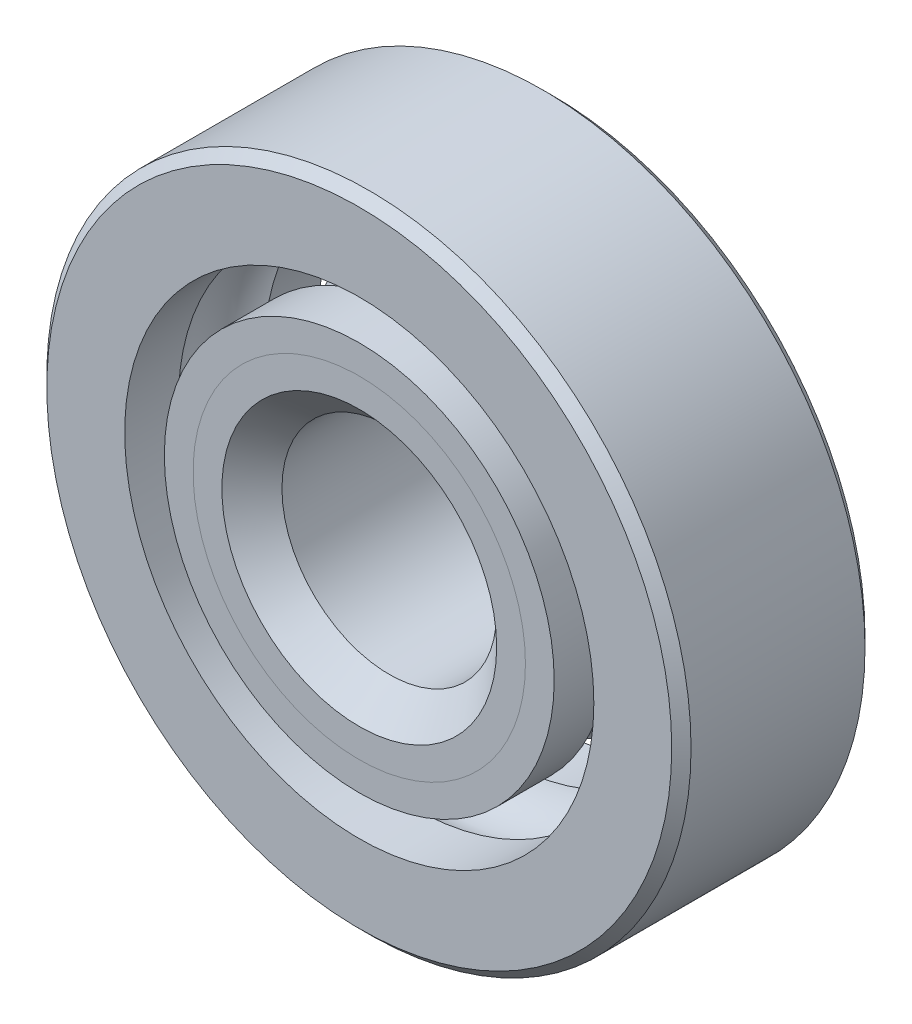
ISO-10303-21;
HEADER;
FILE_DESCRIPTION(('STEP AP214'),'2;1');
FILE_NAME('part.step','',(''),(''),'','','');
FILE_SCHEMA(('AUTOMOTIVE_DESIGN { 1 0 10303 214 1 1 1 1 }'));
ENDSEC;
DATA;
#1=APPLICATION_CONTEXT('core data for automotive mechanical design processes');
#2=APPLICATION_PROTOCOL_DEFINITION('international standard','automotive_design',2000,#1);
#3=PRODUCT_CONTEXT('',#1,'mechanical');
#4=PRODUCT('Part','Part','',(#3));
#5=PRODUCT_RELATED_PRODUCT_CATEGORY('part','',(#4));
#6=PRODUCT_DEFINITION_FORMATION('','',#4);
#7=PRODUCT_DEFINITION_CONTEXT('part definition',#1,'design');
#8=PRODUCT_DEFINITION('design','',#6,#7);
#9=PRODUCT_DEFINITION_SHAPE('','',#8);
#10=(LENGTH_UNIT() NAMED_UNIT(*) SI_UNIT(.MILLI.,.METRE.));
#11=(NAMED_UNIT(*) PLANE_ANGLE_UNIT() SI_UNIT($,.RADIAN.));
#12=(NAMED_UNIT(*) SI_UNIT($,.STERADIAN.) SOLID_ANGLE_UNIT());
#13=UNCERTAINTY_MEASURE_WITH_UNIT(LENGTH_MEASURE(1.E-05),#10,'distance_accuracy_value','');
#14=(GEOMETRIC_REPRESENTATION_CONTEXT(3) GLOBAL_UNCERTAINTY_ASSIGNED_CONTEXT((#13)) GLOBAL_UNIT_ASSIGNED_CONTEXT((#10,
#11,#12)) REPRESENTATION_CONTEXT('',''));
#15=CARTESIAN_POINT('',(0.,0.,0.));
#16=DIRECTION('',(0.,0.,1.));
#17=DIRECTION('',(1.,0.,0.));
#18=AXIS2_PLACEMENT_3D('',#15,#16,#17);
#19=CARTESIAN_POINT('',(0.,10.,0.));
#20=DIRECTION('',(0.,0.,1.));
#21=DIRECTION('',(0.,1.,0.));
#22=AXIS2_PLACEMENT_3D('',#19,#20,#21);
#23=SPHERICAL_SURFACE('',#22,2.20274170204252);
#24=CARTESIAN_POINT('',(0.,10.,2.20274170204251));
#25=VERTEX_POINT('',#24);
#26=VERTEX_LOOP('',#25);
#27=FACE_BOUND('',#26,.T.);
#28=ADVANCED_FACE('F39',(#27),#23,.T.);
#29=CLOSED_SHELL('',(#28));
#30=MANIFOLD_SOLID_BREP('B2',#29);
#31=CARTESIAN_POINT('',(0.,7.73777611295091,4.5));
#32=DIRECTION('',(0.,0.,-1.));
#33=DIRECTION('',(-1.,0.,0.));
#34=AXIS2_PLACEMENT_3D('',#31,#32,#33);
#35=PLANE('',#34);
#36=CARTESIAN_POINT('',(0.,0.,4.5));
#37=DIRECTION('',(0.,0.,1.));
#38=DIRECTION('',(1.,0.,0.));
#39=AXIS2_PLACEMENT_3D('',#36,#37,#38);
#40=CIRCLE('',#39,6.39862914897875);
#41=CARTESIAN_POINT('',(6.39862914897875,0.,4.5));
#42=VERTEX_POINT('',#41);
#43=EDGE_CURVE('E93',#42,#42,#40,.T.);
#44=ORIENTED_EDGE('',*,*,#43,.F.);
#45=EDGE_LOOP('',(#44));
#46=FACE_BOUND('',#45,.T.);
#47=CARTESIAN_POINT('',(0.,0.,4.5));
#48=DIRECTION('',(0.,0.,1.));
#49=DIRECTION('',(1.,0.,0.));
#50=AXIS2_PLACEMENT_3D('',#47,#48,#49);
#51=CIRCLE('',#50,7.73777611295091);
#52=CARTESIAN_POINT('',(7.73777611295091,0.,4.5));
#53=VERTEX_POINT('',#52);
#54=EDGE_CURVE('E38',#53,#53,#51,.T.);
#55=ORIENTED_EDGE('',*,*,#54,.T.);
#56=EDGE_LOOP('',(#55));
#57=FACE_BOUND('',#56,.T.);
#58=ADVANCED_FACE('F59',(#46,#57),#35,.F.);
#59=CARTESIAN_POINT('',(0.,0.,3.16085303602784));
#60=DIRECTION('',(0.,0.,1.));
#61=DIRECTION('',(1.,0.,0.));
#62=AXIS2_PLACEMENT_3D('',#59,#60,#61);
#63=CONICAL_SURFACE('',#62,6.39862914897875,0.78539816339745);
#64=ORIENTED_EDGE('',*,*,#54,.F.);
#65=EDGE_LOOP('',(#64));
#66=FACE_BOUND('',#65,.T.);
#67=CARTESIAN_POINT('',(0.,0.,3.16085303602784));
#68=DIRECTION('',(0.,0.,1.));
#69=DIRECTION('',(1.,0.,0.));
#70=AXIS2_PLACEMENT_3D('',#67,#68,#69);
#71=CIRCLE('',#70,6.39862914897875);
#72=CARTESIAN_POINT('',(6.39862914897875,0.,3.16085303602784));
#73=VERTEX_POINT('',#72);
#74=EDGE_CURVE('E65',#73,#73,#71,.T.);
#75=ORIENTED_EDGE('',*,*,#74,.T.);
#76=EDGE_LOOP('',(#75));
#77=FACE_BOUND('',#76,.T.);
#78=ADVANCED_FACE('F100',(#66,#77),#63,.T.);
#79=CARTESIAN_POINT('',(0.,0.,4.5));
#80=DIRECTION('',(0.,0.,1.));
#81=DIRECTION('',(1.,0.,0.));
#82=AXIS2_PLACEMENT_3D('',#79,#80,#81);
#83=CYLINDRICAL_SURFACE('',#82,6.39862914897875);
#84=ORIENTED_EDGE('',*,*,#74,.F.);
#85=EDGE_LOOP('',(#84));
#86=FACE_BOUND('',#85,.T.);
#87=CARTESIAN_POINT('',(0.,0.,0.));
#88=DIRECTION('',(0.,0.,1.));
#89=DIRECTION('',(1.,0.,0.));
#90=AXIS2_PLACEMENT_3D('',#87,#88,#89);
#91=CIRCLE('',#90,6.39862914897875);
#92=CARTESIAN_POINT('',(6.39862914897875,0.,0.));
#93=VERTEX_POINT('',#92);
#94=EDGE_CURVE('E69',#93,#93,#91,.T.);
#95=ORIENTED_EDGE('',*,*,#94,.T.);
#96=EDGE_LOOP('',(#95));
#97=FACE_BOUND('',#96,.T.);
#98=ADVANCED_FACE('F104',(#86,#97),#83,.T.);
#99=CARTESIAN_POINT('',(0.,6.39862914897875,0.));
#100=DIRECTION('',(0.,0.,-1.));
#101=DIRECTION('',(-1.,0.,0.));
#102=AXIS2_PLACEMENT_3D('',#99,#100,#101);
#103=PLANE('',#102);
#104=ORIENTED_EDGE('',*,*,#94,.F.);
#105=EDGE_LOOP('',(#104));
#106=FACE_BOUND('',#105,.T.);
#107=CARTESIAN_POINT('',(0.,0.,0.));
#108=DIRECTION('',(0.,0.,1.));
#109=DIRECTION('',(1.,0.,0.));
#110=AXIS2_PLACEMENT_3D('',#107,#108,#109);
#111=CIRCLE('',#110,7.79725829795749);
#112=CARTESIAN_POINT('',(7.79725829795749,0.,0.));
#113=VERTEX_POINT('',#112);
#114=EDGE_CURVE('E73',#113,#113,#111,.T.);
#115=ORIENTED_EDGE('',*,*,#114,.T.);
#116=EDGE_LOOP('',(#115));
#117=FACE_BOUND('',#116,.T.);
#118=ADVANCED_FACE('F109',(#106,#117),#103,.F.);
#119=CARTESIAN_POINT('',(0.,0.,0.));
#120=DIRECTION('',(0.,0.,1.));
#121=DIRECTION('',(1.,0.,0.));
#122=AXIS2_PLACEMENT_3D('',#119,#120,#121);
#123=TOROIDAL_SURFACE('',#122,10.,2.20274170204251);
#124=ORIENTED_EDGE('',*,*,#114,.F.);
#125=EDGE_LOOP('',(#124));
#126=FACE_BOUND('',#125,.T.);
#127=CARTESIAN_POINT('',(0.,0.,-2.));
#128=DIRECTION('',(0.,0.,1.));
#129=DIRECTION('',(1.,0.,0.));
#130=AXIS2_PLACEMENT_3D('',#127,#128,#129);
#131=CIRCLE('',#130,9.07692307692308);
#132=CARTESIAN_POINT('',(9.07692307692308,0.,-2.));
#133=VERTEX_POINT('',#132);
#134=EDGE_CURVE('E78',#133,#133,#131,.T.);
#135=ORIENTED_EDGE('',*,*,#134,.T.);
#136=EDGE_LOOP('',(#135));
#137=FACE_BOUND('',#136,.T.);
#138=ADVANCED_FACE('F115',(#126,#137),#123,.F.);
#139=CARTESIAN_POINT('',(0.,0.,4.5));
#140=DIRECTION('',(0.,0.,1.));
#141=DIRECTION('',(1.,0.,0.));
#142=AXIS2_PLACEMENT_3D('',#139,#140,#141);
#143=CYLINDRICAL_SURFACE('',#142,9.07692307692308);
#144=ORIENTED_EDGE('',*,*,#134,.F.);
#145=EDGE_LOOP('',(#144));
#146=FACE_BOUND('',#145,.T.);
#147=CARTESIAN_POINT('',(0.,0.,-4.50000000000001));
#148=DIRECTION('',(0.,0.,1.));
#149=DIRECTION('',(1.,0.,0.));
#150=AXIS2_PLACEMENT_3D('',#147,#148,#149);
#151=CIRCLE('',#150,9.07692307692308);
#152=CARTESIAN_POINT('',(9.07692307692308,0.,-4.50000000000001));
#153=VERTEX_POINT('',#152);
#154=EDGE_CURVE('E81',#153,#153,#151,.T.);
#155=ORIENTED_EDGE('',*,*,#154,.T.);
#156=EDGE_LOOP('',(#155));
#157=FACE_BOUND('',#156,.T.);
#158=ADVANCED_FACE('F119',(#146,#157),#143,.T.);
#159=CARTESIAN_POINT('',(0.,5.45,-4.50000000000001));
#160=DIRECTION('',(0.,0.,1.));
#161=DIRECTION('',(1.,0.,0.));
#162=AXIS2_PLACEMENT_3D('',#159,#160,#161);
#163=PLANE('',#162);
#164=ORIENTED_EDGE('',*,*,#154,.F.);
#165=EDGE_LOOP('',(#164));
#166=FACE_BOUND('',#165,.T.);
#167=CARTESIAN_POINT('',(0.,0.,-4.50000000000001));
#168=DIRECTION('',(0.,0.,1.));
#169=DIRECTION('',(1.,0.,0.));
#170=AXIS2_PLACEMENT_3D('',#167,#168,#169);
#171=CIRCLE('',#170,5.45);
#172=CARTESIAN_POINT('',(5.45,0.,-4.50000000000001));
#173=VERTEX_POINT('',#172);
#174=EDGE_CURVE('E84',#173,#173,#171,.T.);
#175=ORIENTED_EDGE('',*,*,#174,.T.);
#176=EDGE_LOOP('',(#175));
#177=FACE_BOUND('',#176,.T.);
#178=ADVANCED_FACE('F123',(#166,#177),#163,.F.);
#179=CARTESIAN_POINT('',(0.,0.,-4.05000000000001));
#180=DIRECTION('',(0.,0.,-1.));
#181=DIRECTION('',(-1.,0.,0.));
#182=AXIS2_PLACEMENT_3D('',#179,#180,#181);
#183=CONICAL_SURFACE('',#182,5.,0.785398163397448);
#184=ORIENTED_EDGE('',*,*,#174,.F.);
#185=EDGE_LOOP('',(#184));
#186=FACE_BOUND('',#185,.T.);
#187=CARTESIAN_POINT('',(0.,0.,-4.05000000000001));
#188=DIRECTION('',(0.,0.,1.));
#189=DIRECTION('',(1.,0.,0.));
#190=AXIS2_PLACEMENT_3D('',#187,#188,#189);
#191=CIRCLE('',#190,5.);
#192=CARTESIAN_POINT('',(5.,0.,-4.05000000000001));
#193=VERTEX_POINT('',#192);
#194=EDGE_CURVE('E87',#193,#193,#191,.T.);
#195=ORIENTED_EDGE('',*,*,#194,.T.);
#196=EDGE_LOOP('',(#195));
#197=FACE_BOUND('',#196,.T.);
#198=ADVANCED_FACE('F127',(#186,#197),#183,.F.);
#199=CARTESIAN_POINT('',(0.,0.,4.5));
#200=DIRECTION('',(0.,0.,1.));
#201=DIRECTION('',(1.,0.,0.));
#202=AXIS2_PLACEMENT_3D('',#199,#200,#201);
#203=CYLINDRICAL_SURFACE('',#202,5.);
#204=ORIENTED_EDGE('',*,*,#194,.F.);
#205=EDGE_LOOP('',(#204));
#206=FACE_BOUND('',#205,.T.);
#207=CARTESIAN_POINT('',(0.,0.,3.10137085102126));
#208=DIRECTION('',(0.,0.,1.));
#209=DIRECTION('',(1.,0.,0.));
#210=AXIS2_PLACEMENT_3D('',#207,#208,#209);
#211=CIRCLE('',#210,5.);
#212=CARTESIAN_POINT('',(5.,0.,3.10137085102126));
#213=VERTEX_POINT('',#212);
#214=EDGE_CURVE('E90',#213,#213,#211,.T.);
#215=ORIENTED_EDGE('',*,*,#214,.T.);
#216=EDGE_LOOP('',(#215));
#217=FACE_BOUND('',#216,.T.);
#218=ADVANCED_FACE('F131',(#206,#217),#203,.F.);
#219=CARTESIAN_POINT('',(0.,0.,4.5));
#220=DIRECTION('',(0.,0.,1.));
#221=DIRECTION('',(1.,0.,0.));
#222=AXIS2_PLACEMENT_3D('',#219,#220,#221);
#223=CONICAL_SURFACE('',#222,6.39862914897875,0.78539816339745);
#224=ORIENTED_EDGE('',*,*,#214,.F.);
#225=EDGE_LOOP('',(#224));
#226=FACE_BOUND('',#225,.T.);
#227=ORIENTED_EDGE('',*,*,#43,.T.);
#228=EDGE_LOOP('',(#227));
#229=FACE_BOUND('',#228,.T.);
#230=ADVANCED_FACE('F97',(#226,#229),#223,.F.);
#231=CLOSED_SHELL('',(#58,#78,#98,#118,#138,#158,#178,#198,#218,#230));
#232=MANIFOLD_SOLID_BREP('B6',#231);
#233=CARTESIAN_POINT('',(0.,9.07692307692308,4.5));
#234=DIRECTION('',(0.,0.,-1.));
#235=DIRECTION('',(-1.,0.,0.));
#236=AXIS2_PLACEMENT_3D('',#233,#234,#235);
#237=PLANE('',#236);
#238=CARTESIAN_POINT('',(0.,0.,4.5));
#239=DIRECTION('',(0.,0.,1.));
#240=DIRECTION('',(1.,0.,0.));
#241=AXIS2_PLACEMENT_3D('',#238,#239,#240);
#242=CIRCLE('',#241,7.73777611295091);
#243=CARTESIAN_POINT('',(7.73777611295091,0.,4.5));
#244=VERTEX_POINT('',#243);
#245=EDGE_CURVE('E58',#244,#244,#242,.T.);
#246=ORIENTED_EDGE('',*,*,#245,.F.);
#247=EDGE_LOOP('',(#246));
#248=FACE_BOUND('',#247,.T.);
#249=CARTESIAN_POINT('',(0.,0.,4.5));
#250=DIRECTION('',(0.,0.,1.));
#251=DIRECTION('',(1.,0.,0.));
#252=AXIS2_PLACEMENT_3D('',#249,#250,#251);
#253=CIRCLE('',#252,9.07692307692308);
#254=CARTESIAN_POINT('',(9.07692307692308,0.,4.5));
#255=VERTEX_POINT('',#254);
#256=EDGE_CURVE('E239',#255,#255,#253,.T.);
#257=ORIENTED_EDGE('',*,*,#256,.T.);
#258=EDGE_LOOP('',(#257));
#259=FACE_BOUND('',#258,.T.);
#260=ADVANCED_FACE('F217',(#248,#259),#237,.F.);
#261=CARTESIAN_POINT('',(0.,0.,4.5));
#262=DIRECTION('',(0.,0.,1.));
#263=DIRECTION('',(1.,0.,0.));
#264=AXIS2_PLACEMENT_3D('',#261,#262,#263);
#265=CONICAL_SURFACE('',#264,7.73777611295091,0.78539816339745);
#266=CARTESIAN_POINT('',(0.,0.,3.16085303602784));
#267=DIRECTION('',(0.,0.,1.));
#268=DIRECTION('',(1.,0.,0.));
#269=AXIS2_PLACEMENT_3D('',#266,#267,#268);
#270=CIRCLE('',#269,6.39862914897875);
#271=CARTESIAN_POINT('',(6.39862914897875,0.,3.16085303602784));
#272=VERTEX_POINT('',#271);
#273=EDGE_CURVE('E223',#272,#272,#270,.T.);
#274=ORIENTED_EDGE('',*,*,#273,.F.);
#275=EDGE_LOOP('',(#274));
#276=FACE_BOUND('',#275,.T.);
#277=ORIENTED_EDGE('',*,*,#245,.T.);
#278=EDGE_LOOP('',(#277));
#279=FACE_BOUND('',#278,.T.);
#280=ADVANCED_FACE('F264',(#276,#279),#265,.F.);
#281=CARTESIAN_POINT('',(0.,0.,4.5));
#282=DIRECTION('',(0.,0.,1.));
#283=DIRECTION('',(1.,0.,0.));
#284=AXIS2_PLACEMENT_3D('',#281,#282,#283);
#285=CYLINDRICAL_SURFACE('',#284,6.39862914897875);
#286=CARTESIAN_POINT('',(0.,0.,0.));
#287=DIRECTION('',(0.,0.,1.));
#288=DIRECTION('',(1.,0.,0.));
#289=AXIS2_PLACEMENT_3D('',#286,#287,#288);
#290=CIRCLE('',#289,6.39862914897875);
#291=CARTESIAN_POINT('',(6.39862914897875,0.,0.));
#292=VERTEX_POINT('',#291);
#293=EDGE_CURVE('E227',#292,#292,#290,.T.);
#294=ORIENTED_EDGE('',*,*,#293,.F.);
#295=EDGE_LOOP('',(#294));
#296=FACE_BOUND('',#295,.T.);
#297=ORIENTED_EDGE('',*,*,#273,.T.);
#298=EDGE_LOOP('',(#297));
#299=FACE_BOUND('',#298,.T.);
#300=ADVANCED_FACE('F259',(#296,#299),#285,.F.);
#301=CARTESIAN_POINT('',(0.,6.39862914897875,0.));
#302=DIRECTION('',(0.,0.,1.));
#303=DIRECTION('',(1.,0.,0.));
#304=AXIS2_PLACEMENT_3D('',#301,#302,#303);
#305=PLANE('',#304);
#306=CARTESIAN_POINT('',(0.,0.,0.));
#307=DIRECTION('',(0.,0.,1.));
#308=DIRECTION('',(1.,0.,0.));
#309=AXIS2_PLACEMENT_3D('',#306,#307,#308);
#310=CIRCLE('',#309,7.79725829795749);
#311=CARTESIAN_POINT('',(7.79725829795749,0.,0.));
#312=VERTEX_POINT('',#311);
#313=EDGE_CURVE('E231',#312,#312,#310,.T.);
#314=ORIENTED_EDGE('',*,*,#313,.F.);
#315=EDGE_LOOP('',(#314));
#316=FACE_BOUND('',#315,.T.);
#317=ORIENTED_EDGE('',*,*,#293,.T.);
#318=EDGE_LOOP('',(#317));
#319=FACE_BOUND('',#318,.T.);
#320=ADVANCED_FACE('F253',(#316,#319),#305,.F.);
#321=CARTESIAN_POINT('',(0.,0.,0.));
#322=DIRECTION('',(0.,0.,1.));
#323=DIRECTION('',(1.,0.,0.));
#324=AXIS2_PLACEMENT_3D('',#321,#322,#323);
#325=TOROIDAL_SURFACE('',#324,10.,2.20274170204252);
#326=CARTESIAN_POINT('',(0.,0.,1.99999999999999));
#327=DIRECTION('',(0.,0.,1.));
#328=DIRECTION('',(1.,0.,0.));
#329=AXIS2_PLACEMENT_3D('',#326,#327,#328);
#330=CIRCLE('',#329,9.07692307692308);
#331=CARTESIAN_POINT('',(9.07692307692308,0.,1.99999999999999));
#332=VERTEX_POINT('',#331);
#333=EDGE_CURVE('E236',#332,#332,#330,.T.);
#334=ORIENTED_EDGE('',*,*,#333,.F.);
#335=EDGE_LOOP('',(#334));
#336=FACE_BOUND('',#335,.T.);
#337=ORIENTED_EDGE('',*,*,#313,.T.);
#338=EDGE_LOOP('',(#337));
#339=FACE_BOUND('',#338,.T.);
#340=ADVANCED_FACE('F247',(#336,#339),#325,.F.);
#341=CARTESIAN_POINT('',(0.,0.,4.5));
#342=DIRECTION('',(0.,0.,1.));
#343=DIRECTION('',(1.,0.,0.));
#344=AXIS2_PLACEMENT_3D('',#341,#342,#343);
#345=CYLINDRICAL_SURFACE('',#344,9.07692307692308);
#346=ORIENTED_EDGE('',*,*,#256,.F.);
#347=EDGE_LOOP('',(#346));
#348=FACE_BOUND('',#347,.T.);
#349=ORIENTED_EDGE('',*,*,#333,.T.);
#350=EDGE_LOOP('',(#349));
#351=FACE_BOUND('',#350,.T.);
#352=ADVANCED_FACE('F244',(#348,#351),#345,.T.);
#353=CLOSED_SHELL('',(#260,#280,#300,#320,#340,#352));
#354=MANIFOLD_SOLID_BREP('B33',#353);
#355=CARTESIAN_POINT('',(0.,0.,4.05));
#356=DIRECTION('',(0.,0.,-1.));
#357=DIRECTION('',(-1.,0.,0.));
#358=AXIS2_PLACEMENT_3D('',#355,#356,#357);
#359=CONICAL_SURFACE('',#358,15.,0.785398163397448);
#360=CARTESIAN_POINT('',(0.,0.,4.5));
#361=DIRECTION('',(0.,0.,1.));
#362=DIRECTION('',(1.,0.,0.));
#363=AXIS2_PLACEMENT_3D('',#360,#361,#362);
#364=CIRCLE('',#363,14.55);
#365=CARTESIAN_POINT('',(14.55,0.,4.5));
#366=VERTEX_POINT('',#365);
#367=EDGE_CURVE('E336',#366,#366,#364,.T.);
#368=ORIENTED_EDGE('',*,*,#367,.F.);
#369=EDGE_LOOP('',(#368));
#370=FACE_BOUND('',#369,.T.);
#371=CARTESIAN_POINT('',(0.,0.,4.05));
#372=DIRECTION('',(0.,0.,1.));
#373=DIRECTION('',(1.,0.,0.));
#374=AXIS2_PLACEMENT_3D('',#371,#372,#373);
#375=CIRCLE('',#374,15.);
#376=CARTESIAN_POINT('',(15.,0.,4.05));
#377=VERTEX_POINT('',#376);
#378=EDGE_CURVE('E216',#377,#377,#375,.T.);
#379=ORIENTED_EDGE('',*,*,#378,.T.);
#380=EDGE_LOOP('',(#379));
#381=FACE_BOUND('',#380,.T.);
#382=ADVANCED_FACE('F308',(#370,#381),#359,.T.);
#383=CARTESIAN_POINT('',(0.,0.,4.5));
#384=DIRECTION('',(0.,0.,1.));
#385=DIRECTION('',(1.,0.,0.));
#386=AXIS2_PLACEMENT_3D('',#383,#384,#385);
#387=CYLINDRICAL_SURFACE('',#386,15.);
#388=ORIENTED_EDGE('',*,*,#378,.F.);
#389=EDGE_LOOP('',(#388));
#390=FACE_BOUND('',#389,.T.);
#391=CARTESIAN_POINT('',(0.,0.,-4.05000000000001));
#392=DIRECTION('',(0.,0.,1.));
#393=DIRECTION('',(1.,0.,0.));
#394=AXIS2_PLACEMENT_3D('',#391,#392,#393);
#395=CIRCLE('',#394,15.);
#396=CARTESIAN_POINT('',(15.,0.,-4.05000000000001));
#397=VERTEX_POINT('',#396);
#398=EDGE_CURVE('E314',#397,#397,#395,.T.);
#399=ORIENTED_EDGE('',*,*,#398,.T.);
#400=EDGE_LOOP('',(#399));
#401=FACE_BOUND('',#400,.T.);
#402=ADVANCED_FACE('F343',(#390,#401),#387,.T.);
#403=CARTESIAN_POINT('',(0.,0.,-4.50000000000001));
#404=DIRECTION('',(0.,0.,1.));
#405=DIRECTION('',(1.,0.,0.));
#406=AXIS2_PLACEMENT_3D('',#403,#404,#405);
#407=CONICAL_SURFACE('',#406,14.55,0.785398163397448);
#408=ORIENTED_EDGE('',*,*,#398,.F.);
#409=EDGE_LOOP('',(#408));
#410=FACE_BOUND('',#409,.T.);
#411=CARTESIAN_POINT('',(0.,0.,-4.50000000000001));
#412=DIRECTION('',(0.,0.,1.));
#413=DIRECTION('',(1.,0.,0.));
#414=AXIS2_PLACEMENT_3D('',#411,#412,#413);
#415=CIRCLE('',#414,14.55);
#416=CARTESIAN_POINT('',(14.55,0.,-4.50000000000001));
#417=VERTEX_POINT('',#416);
#418=EDGE_CURVE('E318',#417,#417,#415,.T.);
#419=ORIENTED_EDGE('',*,*,#418,.T.);
#420=EDGE_LOOP('',(#419));
#421=FACE_BOUND('',#420,.T.);
#422=ADVANCED_FACE('F347',(#410,#421),#407,.T.);
#423=CARTESIAN_POINT('',(0.,14.55,-4.50000000000001));
#424=DIRECTION('',(0.,0.,1.));
#425=DIRECTION('',(1.,0.,0.));
#426=AXIS2_PLACEMENT_3D('',#423,#424,#425);
#427=PLANE('',#426);
#428=ORIENTED_EDGE('',*,*,#418,.F.);
#429=EDGE_LOOP('',(#428));
#430=FACE_BOUND('',#429,.T.);
#431=CARTESIAN_POINT('',(0.,0.,-4.50000000000001));
#432=DIRECTION('',(0.,0.,1.));
#433=DIRECTION('',(1.,0.,0.));
#434=AXIS2_PLACEMENT_3D('',#431,#432,#433);
#435=CIRCLE('',#434,10.9230769230769);
#436=CARTESIAN_POINT('',(10.9230769230769,0.,-4.50000000000001));
#437=VERTEX_POINT('',#436);
#438=EDGE_CURVE('E322',#437,#437,#435,.T.);
#439=ORIENTED_EDGE('',*,*,#438,.T.);
#440=EDGE_LOOP('',(#439));
#441=FACE_BOUND('',#440,.T.);
#442=ADVANCED_FACE('F352',(#430,#441),#427,.F.);
#443=CARTESIAN_POINT('',(0.,0.,4.5));
#444=DIRECTION('',(0.,0.,1.));
#445=DIRECTION('',(1.,0.,0.));
#446=AXIS2_PLACEMENT_3D('',#443,#444,#445);
#447=CYLINDRICAL_SURFACE('',#446,10.9230769230769);
#448=ORIENTED_EDGE('',*,*,#438,.F.);
#449=EDGE_LOOP('',(#448));
#450=FACE_BOUND('',#449,.T.);
#451=CARTESIAN_POINT('',(0.,0.,-2.00000000000001));
#452=DIRECTION('',(0.,0.,1.));
#453=DIRECTION('',(1.,0.,0.));
#454=AXIS2_PLACEMENT_3D('',#451,#452,#453);
#455=CIRCLE('',#454,10.9230769230769);
#456=CARTESIAN_POINT('',(10.9230769230769,0.,-2.00000000000001));
#457=VERTEX_POINT('',#456);
#458=EDGE_CURVE('E327',#457,#457,#455,.T.);
#459=ORIENTED_EDGE('',*,*,#458,.T.);
#460=EDGE_LOOP('',(#459));
#461=FACE_BOUND('',#460,.T.);
#462=ADVANCED_FACE('F358',(#450,#461),#447,.F.);
#463=CARTESIAN_POINT('',(0.,0.,0.));
#464=DIRECTION('',(0.,0.,1.));
#465=DIRECTION('',(1.,0.,0.));
#466=AXIS2_PLACEMENT_3D('',#463,#464,#465);
#467=TOROIDAL_SURFACE('',#466,10.,2.20274170204252);
#468=ORIENTED_EDGE('',*,*,#458,.F.);
#469=EDGE_LOOP('',(#468));
#470=FACE_BOUND('',#469,.T.);
#471=CARTESIAN_POINT('',(0.,0.,2.));
#472=DIRECTION('',(0.,0.,1.));
#473=DIRECTION('',(1.,0.,0.));
#474=AXIS2_PLACEMENT_3D('',#471,#472,#473);
#475=CIRCLE('',#474,10.9230769230769);
#476=CARTESIAN_POINT('',(10.9230769230769,0.,2.));
#477=VERTEX_POINT('',#476);
#478=EDGE_CURVE('E330',#477,#477,#475,.T.);
#479=ORIENTED_EDGE('',*,*,#478,.T.);
#480=EDGE_LOOP('',(#479));
#481=FACE_BOUND('',#480,.T.);
#482=ADVANCED_FACE('F362',(#470,#481),#467,.F.);
#483=CARTESIAN_POINT('',(0.,0.,4.5));
#484=DIRECTION('',(0.,0.,1.));
#485=DIRECTION('',(1.,0.,0.));
#486=AXIS2_PLACEMENT_3D('',#483,#484,#485);
#487=CYLINDRICAL_SURFACE('',#486,10.9230769230769);
#488=ORIENTED_EDGE('',*,*,#478,.F.);
#489=EDGE_LOOP('',(#488));
#490=FACE_BOUND('',#489,.T.);
#491=CARTESIAN_POINT('',(0.,0.,4.5));
#492=DIRECTION('',(0.,0.,1.));
#493=DIRECTION('',(1.,0.,0.));
#494=AXIS2_PLACEMENT_3D('',#491,#492,#493);
#495=CIRCLE('',#494,10.9230769230769);
#496=CARTESIAN_POINT('',(10.9230769230769,0.,4.5));
#497=VERTEX_POINT('',#496);
#498=EDGE_CURVE('E333',#497,#497,#495,.T.);
#499=ORIENTED_EDGE('',*,*,#498,.T.);
#500=EDGE_LOOP('',(#499));
#501=FACE_BOUND('',#500,.T.);
#502=ADVANCED_FACE('F366',(#490,#501),#487,.F.);
#503=CARTESIAN_POINT('',(0.,14.55,4.5));
#504=DIRECTION('',(0.,0.,-1.));
#505=DIRECTION('',(-1.,0.,0.));
#506=AXIS2_PLACEMENT_3D('',#503,#504,#505);
#507=PLANE('',#506);
#508=ORIENTED_EDGE('',*,*,#498,.F.);
#509=EDGE_LOOP('',(#508));
#510=FACE_BOUND('',#509,.T.);
#511=ORIENTED_EDGE('',*,*,#367,.T.);
#512=EDGE_LOOP('',(#511));
#513=FACE_BOUND('',#512,.T.);
#514=ADVANCED_FACE('F340',(#510,#513),#507,.F.);
#515=CLOSED_SHELL('',(#382,#402,#422,#442,#462,#482,#502,#514));
#516=MANIFOLD_SOLID_BREP('B53',#515);
#517=ADVANCED_BREP_SHAPE_REPRESENTATION('',(#18,#30,#232,#354,#516),#14);
#518=SHAPE_DEFINITION_REPRESENTATION(#9,#517);
ENDSEC;
END-ISO-10303-21;
